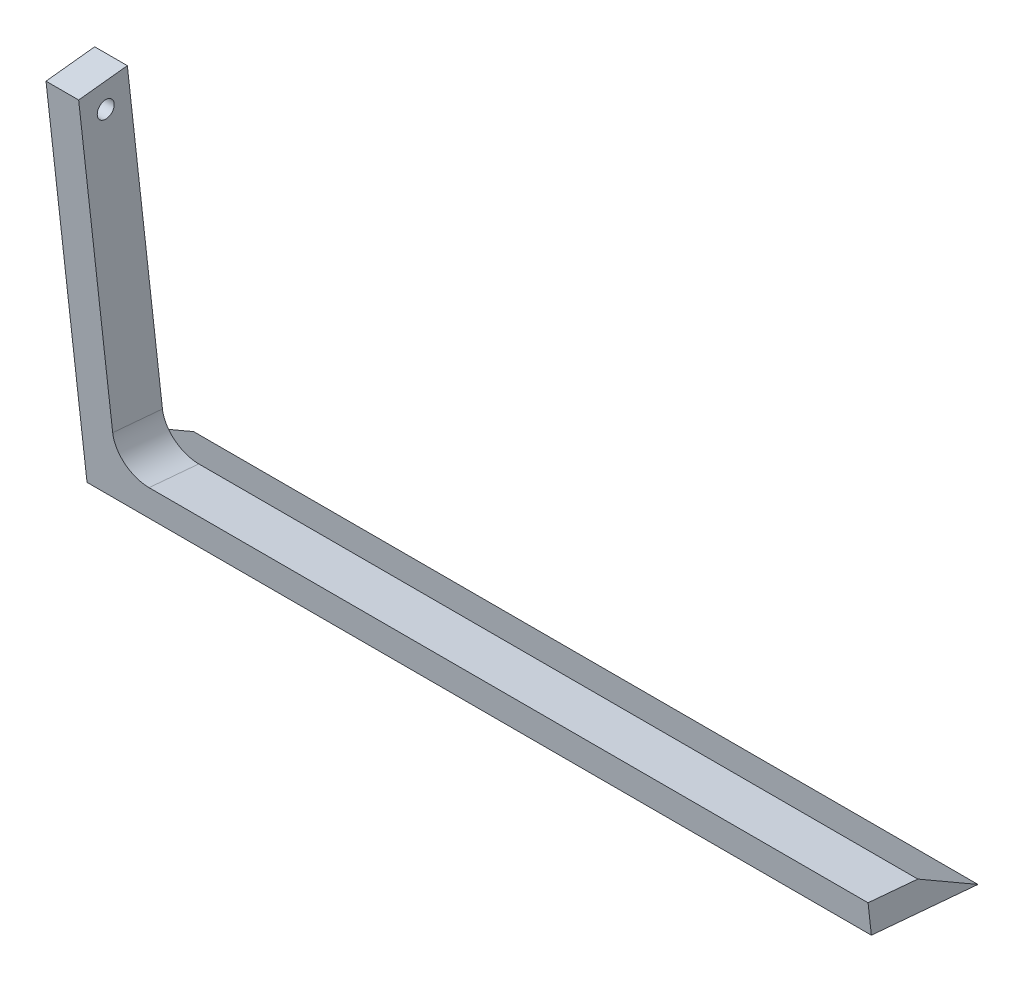
ISO-10303-21;
HEADER;
FILE_DESCRIPTION(('STEP AP214'),'2;1');
FILE_NAME('part.step','',(''),(''),'','','');
FILE_SCHEMA(('AUTOMOTIVE_DESIGN { 1 0 10303 214 1 1 1 1 }'));
ENDSEC;
DATA;
#1=APPLICATION_CONTEXT('core data for automotive mechanical design processes');
#2=APPLICATION_PROTOCOL_DEFINITION('international standard','automotive_design',2000,#1);
#3=PRODUCT_CONTEXT('',#1,'mechanical');
#4=PRODUCT('Part','Part','',(#3));
#5=PRODUCT_RELATED_PRODUCT_CATEGORY('part','',(#4));
#6=PRODUCT_DEFINITION_FORMATION('','',#4);
#7=PRODUCT_DEFINITION_CONTEXT('part definition',#1,'design');
#8=PRODUCT_DEFINITION('design','',#6,#7);
#9=PRODUCT_DEFINITION_SHAPE('','',#8);
#10=(LENGTH_UNIT() NAMED_UNIT(*) SI_UNIT(.MILLI.,.METRE.));
#11=(NAMED_UNIT(*) PLANE_ANGLE_UNIT() SI_UNIT($,.RADIAN.));
#12=(NAMED_UNIT(*) SI_UNIT($,.STERADIAN.) SOLID_ANGLE_UNIT());
#13=UNCERTAINTY_MEASURE_WITH_UNIT(LENGTH_MEASURE(1.E-05),#10,'distance_accuracy_value','');
#14=(GEOMETRIC_REPRESENTATION_CONTEXT(3) GLOBAL_UNCERTAINTY_ASSIGNED_CONTEXT((#13)) GLOBAL_UNIT_ASSIGNED_CONTEXT((#10,
#11,#12)) REPRESENTATION_CONTEXT('',''));
#15=CARTESIAN_POINT('',(0.,0.,0.));
#16=DIRECTION('',(0.,0.,1.));
#17=DIRECTION('',(1.,0.,0.));
#18=AXIS2_PLACEMENT_3D('',#15,#16,#17);
#19=CARTESIAN_POINT('',(6.10886628260686,363.884836728764,-312.549454326368));
#20=DIRECTION('',(-1.,0.,0.));
#21=DIRECTION('',(0.,-1.,0.));
#22=AXIS2_PLACEMENT_3D('',#19,#20,#21);
#23=CYLINDRICAL_SURFACE('',#22,2.35);
#24=CARTESIAN_POINT('',(-0.241133717393143,363.884836728764,-312.549454326368));
#25=DIRECTION('',(-1.,0.,0.));
#26=DIRECTION('',(0.,1.,0.));
#27=AXIS2_PLACEMENT_3D('',#24,#25,#26);
#28=CIRCLE('',#27,2.35);
#29=CARTESIAN_POINT('',(-0.241133717393144,366.234836728764,-312.549454326368));
#30=VERTEX_POINT('',#29);
#31=EDGE_CURVE('E135',#30,#30,#28,.T.);
#32=ORIENTED_EDGE('',*,*,#31,.T.);
#33=EDGE_LOOP('',(#32));
#34=FACE_BOUND('',#33,.T.);
#35=CARTESIAN_POINT('',(2.93386628260686,363.884836728764,-312.549454326368));
#36=DIRECTION('',(-1.,0.,0.));
#37=DIRECTION('',(0.,1.,0.));
#38=AXIS2_PLACEMENT_3D('',#35,#36,#37);
#39=CIRCLE('',#38,2.35);
#40=CARTESIAN_POINT('',(2.93386628260686,366.234836728764,-312.549454326368));
#41=VERTEX_POINT('',#40);
#42=EDGE_CURVE('E126',#41,#41,#39,.T.);
#43=ORIENTED_EDGE('',*,*,#42,.F.);
#44=EDGE_LOOP('',(#43));
#45=FACE_BOUND('',#44,.T.);
#46=ADVANCED_FACE('F37',(#34,#45),#23,.F.);
#47=CARTESIAN_POINT('',(6.10886628260685,329.732901851281,36.7612517386009));
#48=DIRECTION('',(0.,-0.993842557983309,-0.110801488894298));
#49=DIRECTION('',(0.,-0.110801488894298,0.993842557983309));
#50=AXIS2_PLACEMENT_3D('',#47,#48,#49);
#51=PLANE('',#50);
#52=DIRECTION('',(0.,0.110801488894298,-0.993842557983309));
#53=VECTOR('',#52,1.);
#54=CARTESIAN_POINT('',(-0.241133717393147,329.732901851281,36.7612517386009));
#55=LINE('',#54,#53);
#56=CARTESIAN_POINT('',(-0.241133717393144,368.0903198203,-307.288587053113));
#57=VERTEX_POINT('',#56);
#58=CARTESIAN_POINT('',(-0.241133717393144,369.145704002018,-316.754937417904));
#59=VERTEX_POINT('',#58);
#60=EDGE_CURVE('E118',#57,#59,#55,.T.);
#61=ORIENTED_EDGE('',*,*,#60,.F.);
#62=DIRECTION('',(-1.,0.,0.));
#63=VECTOR('',#62,1.);
#64=CARTESIAN_POINT('',(6.10886628260686,368.0903198203,-307.288587053113));
#65=LINE('',#64,#63);
#66=CARTESIAN_POINT('',(6.10886628260686,368.0903198203,-307.288587053113));
#67=VERTEX_POINT('',#66);
#68=EDGE_CURVE('E139',#67,#57,#65,.T.);
#69=ORIENTED_EDGE('',*,*,#68,.F.);
#70=DIRECTION('',(0.,0.110801488894298,-0.993842557983309));
#71=VECTOR('',#70,1.);
#72=CARTESIAN_POINT('',(6.10886628260685,329.732901851281,36.7612517386009));
#73=LINE('',#72,#71);
#74=CARTESIAN_POINT('',(6.10886628260686,369.145704002018,-316.754937417904));
#75=VERTEX_POINT('',#74);
#76=EDGE_CURVE('E131',#67,#75,#73,.T.);
#77=ORIENTED_EDGE('',*,*,#76,.T.);
#78=DIRECTION('',(-1.,0.,0.));
#79=VECTOR('',#78,1.);
#80=CARTESIAN_POINT('',(6.10886628260686,369.145704002018,-316.754937417904));
#81=LINE('',#80,#79);
#82=EDGE_CURVE('E160',#75,#59,#81,.T.);
#83=ORIENTED_EDGE('',*,*,#82,.T.);
#84=EDGE_LOOP('',(#61,#69,#77,#83));
#85=FACE_BOUND('',#84,.T.);
#86=ADVANCED_FACE('F175',(#85),#51,.F.);
#87=CARTESIAN_POINT('',(6.1088662826069,39.4128021507381,-353.516189156505));
#88=DIRECTION('',(0.,-0.1108014888943,0.993842557983309));
#89=DIRECTION('',(0.,0.993842557983309,0.1108014888943));
#90=AXIS2_PLACEMENT_3D('',#87,#88,#89);
#91=PLANE('',#90);
#92=DIRECTION('',(0.,-0.993842557983309,-0.1108014888943));
#93=VECTOR('',#92,1.);
#94=CARTESIAN_POINT('',(-0.241133717393097,39.4128021507381,-353.516189156505));
#95=LINE('',#94,#93);
#96=CARTESIAN_POINT('',(-0.241133717393134,301.481270762538,-324.29870769409));
#97=VERTEX_POINT('',#96);
#98=EDGE_CURVE('E122',#59,#97,#95,.T.);
#99=ORIENTED_EDGE('',*,*,#98,.F.);
#100=ORIENTED_EDGE('',*,*,#82,.F.);
#101=DIRECTION('',(0.,-0.993842557983309,-0.1108014888943));
#102=VECTOR('',#101,1.);
#103=CARTESIAN_POINT('',(6.1088662826069,39.4128021507381,-353.516189156505));
#104=LINE('',#103,#102);
#105=CARTESIAN_POINT('',(6.10886628260686,307.918313214694,-323.581054900853));
#106=VERTEX_POINT('',#105);
#107=EDGE_CURVE('E134',#75,#106,#104,.T.);
#108=ORIENTED_EDGE('',*,*,#107,.T.);
#109=CARTESIAN_POINT('',(12.4588662826068,307.918313214694,-323.581054900853));
#110=DIRECTION('',(0.,0.1108014888943,-0.993842557983309));
#111=DIRECTION('',(0.,-0.993842557983309,-0.1108014888943));
#112=AXIS2_PLACEMENT_3D('',#109,#110,#111);
#113=ELLIPSE('',#112,6.47692373449793,6.35);
#114=CARTESIAN_POINT('',(12.4588662826068,301.481270762538,-324.29870769409));
#115=VERTEX_POINT('',#114);
#116=EDGE_CURVE('E46',#115,#106,#113,.T.);
#117=ORIENTED_EDGE('',*,*,#116,.F.);
#118=DIRECTION('',(-1.,0.,0.));
#119=VECTOR('',#118,1.);
#120=CARTESIAN_POINT('',(6.10886628260686,301.481270762538,-324.29870769409));
#121=LINE('',#120,#119);
#122=EDGE_CURVE('E157',#115,#97,#121,.T.);
#123=ORIENTED_EDGE('',*,*,#122,.T.);
#124=EDGE_LOOP('',(#99,#100,#108,#117,#123));
#125=FACE_BOUND('',#124,.T.);
#126=ADVANCED_FACE('F168',(#125),#91,.F.);
#127=CARTESIAN_POINT('',(6.10886628260685,366.536412710678,-211.619896546305));
#128=DIRECTION('',(0.,0.866025403784443,-0.499999999999992));
#129=DIRECTION('',(0.,-0.499999999999993,-0.866025403784443));
#130=AXIS2_PLACEMENT_3D('',#127,#128,#129);
#131=PLANE('',#130);
#132=DIRECTION('',(0.,0.499999999999993,0.866025403784443));
#133=VECTOR('',#132,1.);
#134=CARTESIAN_POINT('',(-0.241133717393146,366.536412710678,-211.619896546305));
#135=LINE('',#134,#133);
#136=CARTESIAN_POINT('',(-0.241133717393133,294.726836728763,-335.997730616961));
#137=VERTEX_POINT('',#136);
#138=EDGE_CURVE('E143',#137,#97,#135,.T.);
#139=ORIENTED_EDGE('',*,*,#138,.T.);
#140=ORIENTED_EDGE('',*,*,#122,.F.);
#141=DIRECTION('',(-1.,0.,0.));
#142=VECTOR('',#141,1.);
#143=CARTESIAN_POINT('',(174.947473615335,301.481270762538,-324.29870769409));
#144=LINE('',#143,#142);
#145=CARTESIAN_POINT('',(152.258866282607,301.481270762538,-324.29870769409));
#146=VERTEX_POINT('',#145);
#147=EDGE_CURVE('E112',#146,#115,#144,.T.);
#148=ORIENTED_EDGE('',*,*,#147,.F.);
#149=DIRECTION('',(0.,-0.499999999999997,-0.86602540378444));
#150=VECTOR('',#149,1.);
#151=CARTESIAN_POINT('',(152.258866282607,294.726836728763,-335.997730616961));
#152=LINE('',#151,#150);
#153=CARTESIAN_POINT('',(152.258866282607,294.726836728763,-335.997730616961));
#154=VERTEX_POINT('',#153);
#155=EDGE_CURVE('E100',#146,#154,#152,.T.);
#156=ORIENTED_EDGE('',*,*,#155,.T.);
#157=DIRECTION('',(-1.,0.,0.));
#158=VECTOR('',#157,1.);
#159=CARTESIAN_POINT('',(6.10886628260687,294.726836728763,-335.997730616961));
#160=LINE('',#159,#158);
#161=EDGE_CURVE('E154',#154,#137,#160,.T.);
#162=ORIENTED_EDGE('',*,*,#161,.T.);
#163=EDGE_LOOP('',(#139,#140,#148,#156,#162));
#164=FACE_BOUND('',#163,.T.);
#165=ADVANCED_FACE('F186',(#164),#131,.T.);
#166=CARTESIAN_POINT('',(6.10886628260686,321.660752090936,-28.14166930918));
#167=DIRECTION('',(0.,-0.996194698091745,0.0871557427476593));
#168=DIRECTION('',(0.,0.0871557427476593,0.996194698091745));
#169=AXIS2_PLACEMENT_3D('',#166,#167,#168);
#170=PLANE('',#169);
#171=DIRECTION('',(0.,-0.0871557427476593,-0.996194698091745));
#172=VECTOR('',#171,1.);
#173=CARTESIAN_POINT('',(-0.241133717393144,321.660752090936,-28.14166930918));
#174=LINE('',#173,#172);
#175=CARTESIAN_POINT('',(-0.241133717393134,296.540670814668,-315.265512146536));
#176=VERTEX_POINT('',#175);
#177=EDGE_CURVE('E145',#176,#137,#174,.T.);
#178=ORIENTED_EDGE('',*,*,#177,.T.);
#179=ORIENTED_EDGE('',*,*,#161,.F.);
#180=DIRECTION('',(0.,0.087155742747662,0.996194698091745));
#181=VECTOR('',#180,1.);
#182=CARTESIAN_POINT('',(152.258866282607,296.540670814668,-315.265512146536));
#183=LINE('',#182,#181);
#184=CARTESIAN_POINT('',(152.258866282607,296.540670814668,-315.265512146536));
#185=VERTEX_POINT('',#184);
#186=EDGE_CURVE('E119',#154,#185,#183,.T.);
#187=ORIENTED_EDGE('',*,*,#186,.T.);
#188=DIRECTION('',(-1.,0.,0.));
#189=VECTOR('',#188,1.);
#190=CARTESIAN_POINT('',(6.10886628260687,296.540670814668,-315.265512146536));
#191=LINE('',#190,#189);
#192=EDGE_CURVE('E116',#185,#176,#191,.T.);
#193=ORIENTED_EDGE('',*,*,#192,.T.);
#194=EDGE_LOOP('',(#178,#179,#187,#193));
#195=FACE_BOUND('',#194,.T.);
#196=ADVANCED_FACE('F179',(#195),#170,.T.);
#197=CARTESIAN_POINT('',(6.1088662826069,38.3574179690196,-344.049838791714));
#198=DIRECTION('',(0.,0.110801488894299,-0.993842557983309));
#199=DIRECTION('',(0.,-0.993842557983309,-0.110801488894299));
#200=AXIS2_PLACEMENT_3D('',#197,#198,#199);
#201=PLANE('',#200);
#202=DIRECTION('',(0.,0.993842557983309,0.110801488894299));
#203=VECTOR('',#202,1.);
#204=CARTESIAN_POINT('',(-0.241133717393097,38.3574179690196,-344.049838791714));
#205=LINE('',#204,#203);
#206=EDGE_CURVE('E147',#176,#57,#205,.T.);
#207=ORIENTED_EDGE('',*,*,#206,.F.);
#208=ORIENTED_EDGE('',*,*,#192,.F.);
#209=DIRECTION('',(0.,0.993842557983309,0.110801488894295));
#210=VECTOR('',#209,1.);
#211=CARTESIAN_POINT('',(152.258866282607,296.540670814668,-315.265512146536));
#212=LINE('',#211,#210);
#213=CARTESIAN_POINT('',(152.258866282607,302.328022410738,-314.620292067713));
#214=VERTEX_POINT('',#213);
#215=EDGE_CURVE('E97',#185,#214,#212,.T.);
#216=ORIENTED_EDGE('',*,*,#215,.T.);
#217=DIRECTION('',(-1.,0.,0.));
#218=VECTOR('',#217,1.);
#219=CARTESIAN_POINT('',(174.947473615335,302.328022410738,-314.620292067713));
#220=LINE('',#219,#218);
#221=CARTESIAN_POINT('',(12.4588662826068,302.328022410738,-314.620292067713));
#222=VERTEX_POINT('',#221);
#223=EDGE_CURVE('E104',#214,#222,#220,.T.);
#224=ORIENTED_EDGE('',*,*,#223,.T.);
#225=CARTESIAN_POINT('',(12.4588662826068,308.765064862895,-313.902639274476));
#226=DIRECTION('',(0.,-0.110801488894299,0.993842557983309));
#227=DIRECTION('',(0.,-0.993842557983309,-0.110801488894299));
#228=AXIS2_PLACEMENT_3D('',#225,#226,#227);
#229=ELLIPSE('',#228,6.47692373449793,6.35);
#230=CARTESIAN_POINT('',(6.10886628260686,308.765064862895,-313.902639274476));
#231=VERTEX_POINT('',#230);
#232=EDGE_CURVE('E11',#231,#222,#229,.T.);
#233=ORIENTED_EDGE('',*,*,#232,.F.);
#234=DIRECTION('',(0.,0.993842557983309,0.110801488894299));
#235=VECTOR('',#234,1.);
#236=CARTESIAN_POINT('',(6.1088662826069,38.3574179690196,-344.049838791714));
#237=LINE('',#236,#235);
#238=EDGE_CURVE('E138',#231,#67,#237,.T.);
#239=ORIENTED_EDGE('',*,*,#238,.T.);
#240=ORIENTED_EDGE('',*,*,#68,.T.);
#241=EDGE_LOOP('',(#207,#208,#216,#224,#233,#239,#240));
#242=FACE_BOUND('',#241,.T.);
#243=ADVANCED_FACE('F114',(#242),#201,.F.);
#244=CARTESIAN_POINT('',(6.1088662826069,0.,0.));
#245=DIRECTION('',(1.,0.,0.));
#246=DIRECTION('',(0.,1.,0.));
#247=AXIS2_PLACEMENT_3D('',#244,#245,#246);
#248=PLANE('',#247);
#249=ORIENTED_EDGE('',*,*,#107,.F.);
#250=ORIENTED_EDGE('',*,*,#76,.F.);
#251=ORIENTED_EDGE('',*,*,#238,.F.);
#252=DIRECTION('',(0.,-0.0871557427476615,-0.996194698091745));
#253=VECTOR('',#252,1.);
#254=CARTESIAN_POINT('',(6.10886628260685,333.673957937022,-29.1926886333166));
#255=LINE('',#254,#253);
#256=EDGE_CURVE('E53',#106,#231,#255,.F.);
#257=ORIENTED_EDGE('',*,*,#256,.F.);
#258=EDGE_LOOP('',(#249,#250,#251,#257));
#259=FACE_BOUND('',#258,.T.);
#260=CARTESIAN_POINT('',(6.10886628260686,363.884836728764,-312.549454326368));
#261=DIRECTION('',(-1.,0.,0.));
#262=DIRECTION('',(0.,1.,0.));
#263=AXIS2_PLACEMENT_3D('',#260,#261,#262);
#264=CIRCLE('',#263,1.64999999999999);
#265=CARTESIAN_POINT('',(6.10886628260686,365.534836728764,-312.549454326368));
#266=VERTEX_POINT('',#265);
#267=EDGE_CURVE('E232',#266,#266,#264,.T.);
#268=ORIENTED_EDGE('',*,*,#267,.T.);
#269=EDGE_LOOP('',(#268));
#270=FACE_BOUND('',#269,.T.);
#271=ADVANCED_FACE('F170',(#259,#270),#248,.T.);
#272=CARTESIAN_POINT('',(-0.2411337173931,0.,0.));
#273=DIRECTION('',(1.,0.,0.));
#274=DIRECTION('',(0.,1.,0.));
#275=AXIS2_PLACEMENT_3D('',#272,#273,#274);
#276=PLANE('',#275);
#277=ORIENTED_EDGE('',*,*,#60,.T.);
#278=ORIENTED_EDGE('',*,*,#98,.T.);
#279=ORIENTED_EDGE('',*,*,#138,.F.);
#280=ORIENTED_EDGE('',*,*,#177,.F.);
#281=ORIENTED_EDGE('',*,*,#206,.T.);
#282=EDGE_LOOP('',(#277,#278,#279,#280,#281));
#283=FACE_BOUND('',#282,.T.);
#284=ORIENTED_EDGE('',*,*,#31,.F.);
#285=EDGE_LOOP('',(#284));
#286=FACE_BOUND('',#285,.T.);
#287=ADVANCED_FACE('F182',(#283,#286),#276,.F.);
#288=CARTESIAN_POINT('',(174.947473615335,301.481270762538,-324.29870769409));
#289=DIRECTION('',(0.,-0.996194698091745,0.0871557427476615));
#290=DIRECTION('',(0.,0.0871557427476615,0.996194698091745));
#291=AXIS2_PLACEMENT_3D('',#288,#289,#290);
#292=PLANE('',#291);
#293=ORIENTED_EDGE('',*,*,#223,.F.);
#294=DIRECTION('',(0.,-0.0871557427476615,-0.996194698091745));
#295=VECTOR('',#294,1.);
#296=CARTESIAN_POINT('',(152.258866282607,301.481270762538,-324.29870769409));
#297=LINE('',#296,#295);
#298=EDGE_CURVE('E93',#214,#146,#297,.T.);
#299=ORIENTED_EDGE('',*,*,#298,.T.);
#300=ORIENTED_EDGE('',*,*,#147,.T.);
#301=DIRECTION('',(0.,-0.0871557427476615,-0.996194698091745));
#302=VECTOR('',#301,1.);
#303=CARTESIAN_POINT('',(12.4588662826068,301.481270762538,-324.29870769409));
#304=LINE('',#303,#302);
#305=EDGE_CURVE('E109',#222,#115,#304,.T.);
#306=ORIENTED_EDGE('',*,*,#305,.F.);
#307=EDGE_LOOP('',(#293,#299,#300,#306));
#308=FACE_BOUND('',#307,.T.);
#309=ADVANCED_FACE('F107',(#308),#292,.F.);
#310=CARTESIAN_POINT('',(152.258866282607,-1.21032750683239E-13,0.));
#311=DIRECTION('',(1.,0.,0.));
#312=DIRECTION('',(0.,1.,0.));
#313=AXIS2_PLACEMENT_3D('',#310,#311,#312);
#314=PLANE('',#313);
#315=ORIENTED_EDGE('',*,*,#298,.F.);
#316=ORIENTED_EDGE('',*,*,#215,.F.);
#317=ORIENTED_EDGE('',*,*,#186,.F.);
#318=ORIENTED_EDGE('',*,*,#155,.F.);
#319=EDGE_LOOP('',(#315,#316,#317,#318));
#320=FACE_BOUND('',#319,.T.);
#321=ADVANCED_FACE('F95',(#320),#314,.T.);
#322=CARTESIAN_POINT('',(12.4588662826068,307.807107095421,-324.852146660538));
#323=DIRECTION('',(0.,-0.0871557427476615,-0.996194698091745));
#324=DIRECTION('',(0.,-0.996194698091745,0.0871557427476615));
#325=AXIS2_PLACEMENT_3D('',#322,#323,#324);
#326=CYLINDRICAL_SURFACE('',#325,6.35);
#327=ORIENTED_EDGE('',*,*,#232,.T.);
#328=ORIENTED_EDGE('',*,*,#305,.T.);
#329=ORIENTED_EDGE('',*,*,#116,.T.);
#330=ORIENTED_EDGE('',*,*,#256,.T.);
#331=EDGE_LOOP('',(#327,#328,#329,#330));
#332=FACE_BOUND('',#331,.T.);
#333=ADVANCED_FACE('F39',(#332),#326,.F.);
#334=CARTESIAN_POINT('',(2.93386628260686,363.884836728764,-312.549454326368));
#335=DIRECTION('',(1.,0.,0.));
#336=DIRECTION('',(0.,1.,0.));
#337=AXIS2_PLACEMENT_3D('',#334,#335,#336);
#338=PLANE('',#337);
#339=CARTESIAN_POINT('',(2.93386628260686,363.884836728764,-312.549454326368));
#340=DIRECTION('',(-1.,0.,0.));
#341=DIRECTION('',(0.,1.,0.));
#342=AXIS2_PLACEMENT_3D('',#339,#340,#341);
#343=CIRCLE('',#342,1.64999999999999);
#344=CARTESIAN_POINT('',(2.93386628260686,365.534836728764,-312.549454326368));
#345=VERTEX_POINT('',#344);
#346=EDGE_CURVE('E229',#345,#345,#343,.T.);
#347=ORIENTED_EDGE('',*,*,#346,.F.);
#348=EDGE_LOOP('',(#347));
#349=FACE_BOUND('',#348,.T.);
#350=ORIENTED_EDGE('',*,*,#42,.T.);
#351=EDGE_LOOP('',(#350));
#352=FACE_BOUND('',#351,.T.);
#353=ADVANCED_FACE('F217',(#349,#352),#338,.F.);
#354=CARTESIAN_POINT('',(2.93386628260686,363.884836728764,-312.549454326368));
#355=DIRECTION('',(1.,0.,0.));
#356=DIRECTION('',(0.,1.,0.));
#357=AXIS2_PLACEMENT_3D('',#354,#355,#356);
#358=CYLINDRICAL_SURFACE('',#357,1.64999999999999);
#359=ORIENTED_EDGE('',*,*,#346,.T.);
#360=EDGE_LOOP('',(#359));
#361=FACE_BOUND('',#360,.T.);
#362=ORIENTED_EDGE('',*,*,#267,.F.);
#363=EDGE_LOOP('',(#362));
#364=FACE_BOUND('',#363,.T.);
#365=ADVANCED_FACE('F220',(#361,#364),#358,.F.);
#366=CLOSED_SHELL('',(#46,#86,#126,#165,#196,#243,#271,#287,#309,#321,#333,#353,#365));
#367=MANIFOLD_SOLID_BREP('B2',#366);
#368=ADVANCED_BREP_SHAPE_REPRESENTATION('',(#18,#367),#14);
#369=SHAPE_DEFINITION_REPRESENTATION(#9,#368);
ENDSEC;
END-ISO-10303-21;
